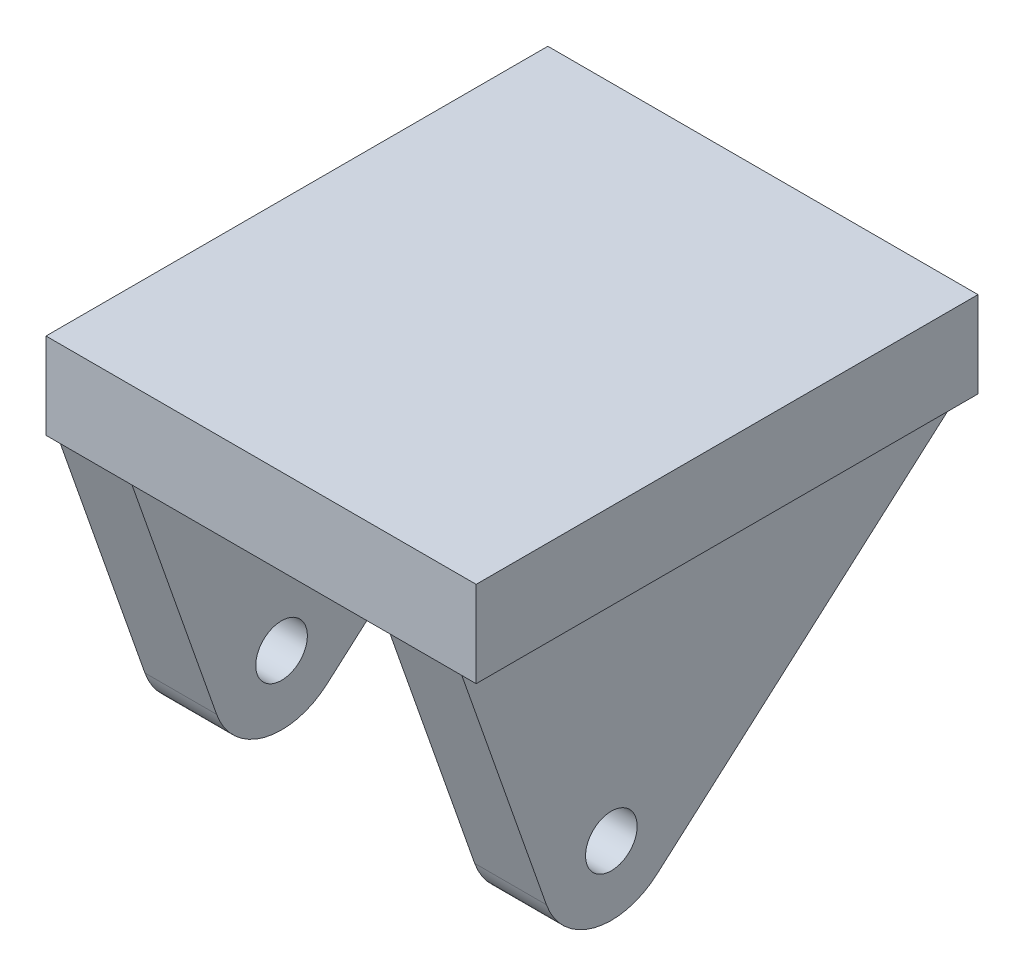
ISO-10303-21;
HEADER;
FILE_DESCRIPTION(('STEP AP214'),'2;1');
FILE_NAME('part.step','',(''),(''),'','','');
FILE_SCHEMA(('AUTOMOTIVE_DESIGN { 1 0 10303 214 1 1 1 1 }'));
ENDSEC;
DATA;
#1=APPLICATION_CONTEXT('core data for automotive mechanical design processes');
#2=APPLICATION_PROTOCOL_DEFINITION('international standard','automotive_design',2000,#1);
#3=PRODUCT_CONTEXT('',#1,'mechanical');
#4=PRODUCT('Part','Part','',(#3));
#5=PRODUCT_RELATED_PRODUCT_CATEGORY('part','',(#4));
#6=PRODUCT_DEFINITION_FORMATION('','',#4);
#7=PRODUCT_DEFINITION_CONTEXT('part definition',#1,'design');
#8=PRODUCT_DEFINITION('design','',#6,#7);
#9=PRODUCT_DEFINITION_SHAPE('','',#8);
#10=(LENGTH_UNIT() NAMED_UNIT(*) SI_UNIT(.MILLI.,.METRE.));
#11=(NAMED_UNIT(*) PLANE_ANGLE_UNIT() SI_UNIT($,.RADIAN.));
#12=(NAMED_UNIT(*) SI_UNIT($,.STERADIAN.) SOLID_ANGLE_UNIT());
#13=UNCERTAINTY_MEASURE_WITH_UNIT(LENGTH_MEASURE(1.E-05),#10,'distance_accuracy_value','');
#14=(GEOMETRIC_REPRESENTATION_CONTEXT(3) GLOBAL_UNCERTAINTY_ASSIGNED_CONTEXT((#13)) GLOBAL_UNIT_ASSIGNED_CONTEXT((#10,
#11,#12)) REPRESENTATION_CONTEXT('',''));
#15=CARTESIAN_POINT('',(0.,0.,0.));
#16=DIRECTION('',(0.,0.,1.));
#17=DIRECTION('',(1.,0.,0.));
#18=AXIS2_PLACEMENT_3D('',#15,#16,#17);
#19=CARTESIAN_POINT('',(-15.,-6.,17.5));
#20=DIRECTION('',(0.,1.,0.));
#21=DIRECTION('',(0.,0.,1.));
#22=AXIS2_PLACEMENT_3D('',#19,#20,#21);
#23=PLANE('',#22);
#24=DIRECTION('',(0.,0.,1.));
#25=VECTOR('',#24,1.);
#26=CARTESIAN_POINT('',(-14.,-6.,17.5));
#27=LINE('',#26,#25);
#28=CARTESIAN_POINT('',(-14.,-6.,-17.5));
#29=VERTEX_POINT('',#28);
#30=CARTESIAN_POINT('',(-14.,-6.,17.5));
#31=VERTEX_POINT('',#30);
#32=EDGE_CURVE('E57',#29,#31,#27,.T.);
#33=ORIENTED_EDGE('',*,*,#32,.T.);
#34=DIRECTION('',(1.,0.,0.));
#35=VECTOR('',#34,1.);
#36=CARTESIAN_POINT('',(-15.,-6.,17.5));
#37=LINE('',#36,#35);
#38=CARTESIAN_POINT('',(-15.,-6.,17.5));
#39=VERTEX_POINT('',#38);
#40=EDGE_CURVE('E234',#39,#31,#37,.T.);
#41=ORIENTED_EDGE('',*,*,#40,.F.);
#42=DIRECTION('',(0.,0.,-1.));
#43=VECTOR('',#42,1.);
#44=CARTESIAN_POINT('',(-15.,-6.,17.5));
#45=LINE('',#44,#43);
#46=CARTESIAN_POINT('',(-15.,-6.,-17.5));
#47=VERTEX_POINT('',#46);
#48=EDGE_CURVE('E11',#39,#47,#45,.T.);
#49=ORIENTED_EDGE('',*,*,#48,.T.);
#50=DIRECTION('',(1.,0.,0.));
#51=VECTOR('',#50,1.);
#52=CARTESIAN_POINT('',(-15.,-6.,-17.5));
#53=LINE('',#52,#51);
#54=EDGE_CURVE('E240',#47,#29,#53,.T.);
#55=ORIENTED_EDGE('',*,*,#54,.T.);
#56=EDGE_LOOP('',(#33,#41,#49,#55));
#57=FACE_BOUND('',#56,.T.);
#58=ADVANCED_FACE('F32',(#57),#23,.F.);
#59=DIRECTION('',(0.,0.,1.));
#60=VECTOR('',#59,1.);
#61=CARTESIAN_POINT('',(14.,-6.,17.5));
#62=LINE('',#61,#60);
#63=CARTESIAN_POINT('',(14.,-6.,-17.5));
#64=VERTEX_POINT('',#63);
#65=CARTESIAN_POINT('',(14.,-6.,17.5));
#66=VERTEX_POINT('',#65);
#67=EDGE_CURVE('E195',#64,#66,#62,.T.);
#68=ORIENTED_EDGE('',*,*,#67,.F.);
#69=CARTESIAN_POINT('',(15.,-6.,-17.5));
#70=VERTEX_POINT('',#69);
#71=EDGE_CURVE('E236',#64,#70,#53,.T.);
#72=ORIENTED_EDGE('',*,*,#71,.T.);
#73=DIRECTION('',(0.,0.,-1.));
#74=VECTOR('',#73,1.);
#75=CARTESIAN_POINT('',(15.,-6.,17.5));
#76=LINE('',#75,#74);
#77=CARTESIAN_POINT('',(15.,-6.,17.5));
#78=VERTEX_POINT('',#77);
#79=EDGE_CURVE('E42',#78,#70,#76,.T.);
#80=ORIENTED_EDGE('',*,*,#79,.F.);
#81=EDGE_CURVE('E191',#66,#78,#37,.T.);
#82=ORIENTED_EDGE('',*,*,#81,.F.);
#83=EDGE_LOOP('',(#68,#72,#80,#82));
#84=FACE_BOUND('',#83,.T.);
#85=ADVANCED_FACE('F295',(#84),#23,.F.);
#86=CARTESIAN_POINT('',(-15.,0.,17.5));
#87=DIRECTION('',(1.,0.,0.));
#88=DIRECTION('',(0.,0.,-1.));
#89=AXIS2_PLACEMENT_3D('',#86,#87,#88);
#90=PLANE('',#89);
#91=DIRECTION('',(0.,-1.,0.));
#92=VECTOR('',#91,1.);
#93=CARTESIAN_POINT('',(-15.,0.,-17.5));
#94=LINE('',#93,#92);
#95=CARTESIAN_POINT('',(-15.,0.,-17.5));
#96=VERTEX_POINT('',#95);
#97=EDGE_CURVE('E201',#96,#47,#94,.T.);
#98=ORIENTED_EDGE('',*,*,#97,.T.);
#99=ORIENTED_EDGE('',*,*,#48,.F.);
#100=DIRECTION('',(0.,-1.,0.));
#101=VECTOR('',#100,1.);
#102=CARTESIAN_POINT('',(-15.,0.,17.5));
#103=LINE('',#102,#101);
#104=CARTESIAN_POINT('',(-15.,0.,17.5));
#105=VERTEX_POINT('',#104);
#106=EDGE_CURVE('E225',#105,#39,#103,.T.);
#107=ORIENTED_EDGE('',*,*,#106,.F.);
#108=DIRECTION('',(0.,0.,-1.));
#109=VECTOR('',#108,1.);
#110=CARTESIAN_POINT('',(-15.,0.,17.5));
#111=LINE('',#110,#109);
#112=EDGE_CURVE('E259',#105,#96,#111,.T.);
#113=ORIENTED_EDGE('',*,*,#112,.T.);
#114=EDGE_LOOP('',(#98,#99,#107,#113));
#115=FACE_BOUND('',#114,.T.);
#116=ADVANCED_FACE('F34',(#115),#90,.F.);
#117=CARTESIAN_POINT('',(-9.,-6.,17.5));
#118=VERTEX_POINT('',#117);
#119=CARTESIAN_POINT('',(9.,-6.,17.5));
#120=VERTEX_POINT('',#119);
#121=EDGE_CURVE('E36',#118,#120,#37,.T.);
#122=ORIENTED_EDGE('',*,*,#121,.F.);
#123=DIRECTION('',(0.,0.,1.));
#124=VECTOR('',#123,1.);
#125=CARTESIAN_POINT('',(-9.,-6.,17.5));
#126=LINE('',#125,#124);
#127=CARTESIAN_POINT('',(-9.,-6.,-17.5));
#128=VERTEX_POINT('',#127);
#129=EDGE_CURVE('E148',#128,#118,#126,.T.);
#130=ORIENTED_EDGE('',*,*,#129,.F.);
#131=CARTESIAN_POINT('',(9.,-6.,-17.5));
#132=VERTEX_POINT('',#131);
#133=EDGE_CURVE('E239',#128,#132,#53,.T.);
#134=ORIENTED_EDGE('',*,*,#133,.T.);
#135=DIRECTION('',(0.,0.,1.));
#136=VECTOR('',#135,1.);
#137=CARTESIAN_POINT('',(9.,-6.,17.5));
#138=LINE('',#137,#136);
#139=EDGE_CURVE('E187',#132,#120,#138,.T.);
#140=ORIENTED_EDGE('',*,*,#139,.T.);
#141=EDGE_LOOP('',(#122,#130,#134,#140));
#142=FACE_BOUND('',#141,.T.);
#143=ADVANCED_FACE('F293',(#142),#23,.F.);
#144=CARTESIAN_POINT('',(15.,0.,17.5));
#145=DIRECTION('',(-1.,0.,0.));
#146=DIRECTION('',(0.,0.,1.));
#147=AXIS2_PLACEMENT_3D('',#144,#145,#146);
#148=PLANE('',#147);
#149=DIRECTION('',(0.,1.,0.));
#150=VECTOR('',#149,1.);
#151=CARTESIAN_POINT('',(15.,0.,-17.5));
#152=LINE('',#151,#150);
#153=CARTESIAN_POINT('',(15.,0.,-17.5));
#154=VERTEX_POINT('',#153);
#155=EDGE_CURVE('E244',#70,#154,#152,.T.);
#156=ORIENTED_EDGE('',*,*,#155,.T.);
#157=DIRECTION('',(0.,0.,-1.));
#158=VECTOR('',#157,1.);
#159=CARTESIAN_POINT('',(15.,0.,17.5));
#160=LINE('',#159,#158);
#161=CARTESIAN_POINT('',(15.,0.,17.5));
#162=VERTEX_POINT('',#161);
#163=EDGE_CURVE('E261',#162,#154,#160,.T.);
#164=ORIENTED_EDGE('',*,*,#163,.F.);
#165=DIRECTION('',(0.,1.,0.));
#166=VECTOR('',#165,1.);
#167=CARTESIAN_POINT('',(15.,0.,17.5));
#168=LINE('',#167,#166);
#169=EDGE_CURVE('E230',#78,#162,#168,.T.);
#170=ORIENTED_EDGE('',*,*,#169,.F.);
#171=ORIENTED_EDGE('',*,*,#79,.T.);
#172=EDGE_LOOP('',(#156,#164,#170,#171));
#173=FACE_BOUND('',#172,.T.);
#174=ADVANCED_FACE('F266',(#173),#148,.F.);
#175=CARTESIAN_POINT('',(-15.,0.,17.5));
#176=DIRECTION('',(0.,-1.,0.));
#177=DIRECTION('',(1.,0.,0.));
#178=AXIS2_PLACEMENT_3D('',#175,#176,#177);
#179=PLANE('',#178);
#180=DIRECTION('',(-1.,0.,0.));
#181=VECTOR('',#180,1.);
#182=CARTESIAN_POINT('',(-15.,0.,-17.5));
#183=LINE('',#182,#181);
#184=EDGE_CURVE('E227',#154,#96,#183,.T.);
#185=ORIENTED_EDGE('',*,*,#184,.T.);
#186=ORIENTED_EDGE('',*,*,#112,.F.);
#187=DIRECTION('',(-1.,0.,0.));
#188=VECTOR('',#187,1.);
#189=CARTESIAN_POINT('',(-15.,0.,17.5));
#190=LINE('',#189,#188);
#191=EDGE_CURVE('E262',#162,#105,#190,.T.);
#192=ORIENTED_EDGE('',*,*,#191,.F.);
#193=ORIENTED_EDGE('',*,*,#163,.T.);
#194=EDGE_LOOP('',(#185,#186,#192,#193));
#195=FACE_BOUND('',#194,.T.);
#196=ADVANCED_FACE('F279',(#195),#179,.F.);
#197=CARTESIAN_POINT('',(-15.,-6.,17.5));
#198=DIRECTION('',(0.,0.,1.));
#199=DIRECTION('',(1.,0.,0.));
#200=AXIS2_PLACEMENT_3D('',#197,#198,#199);
#201=PLANE('',#200);
#202=ORIENTED_EDGE('',*,*,#106,.T.);
#203=ORIENTED_EDGE('',*,*,#40,.T.);
#204=DIRECTION('',(1.,0.,0.));
#205=VECTOR('',#204,1.);
#206=CARTESIAN_POINT('',(-14.,-6.,17.5));
#207=LINE('',#206,#205);
#208=EDGE_CURVE('E147',#31,#118,#207,.T.);
#209=ORIENTED_EDGE('',*,*,#208,.T.);
#210=ORIENTED_EDGE('',*,*,#121,.T.);
#211=DIRECTION('',(1.,0.,0.));
#212=VECTOR('',#211,1.);
#213=CARTESIAN_POINT('',(9.,-6.,17.5));
#214=LINE('',#213,#212);
#215=EDGE_CURVE('E198',#120,#66,#214,.T.);
#216=ORIENTED_EDGE('',*,*,#215,.T.);
#217=ORIENTED_EDGE('',*,*,#81,.T.);
#218=ORIENTED_EDGE('',*,*,#169,.T.);
#219=ORIENTED_EDGE('',*,*,#191,.T.);
#220=EDGE_LOOP('',(#202,#203,#209,#210,#216,#217,#218,#219));
#221=FACE_BOUND('',#220,.T.);
#222=ADVANCED_FACE('F281',(#221),#201,.T.);
#223=CARTESIAN_POINT('',(-15.,-6.,-17.5));
#224=DIRECTION('',(0.,0.,1.));
#225=DIRECTION('',(1.,0.,0.));
#226=AXIS2_PLACEMENT_3D('',#223,#224,#225);
#227=PLANE('',#226);
#228=ORIENTED_EDGE('',*,*,#97,.F.);
#229=ORIENTED_EDGE('',*,*,#184,.F.);
#230=ORIENTED_EDGE('',*,*,#155,.F.);
#231=ORIENTED_EDGE('',*,*,#71,.F.);
#232=DIRECTION('',(1.,0.,0.));
#233=VECTOR('',#232,1.);
#234=CARTESIAN_POINT('',(9.,-6.,-17.5));
#235=LINE('',#234,#233);
#236=EDGE_CURVE('E202',#132,#64,#235,.T.);
#237=ORIENTED_EDGE('',*,*,#236,.F.);
#238=ORIENTED_EDGE('',*,*,#133,.F.);
#239=DIRECTION('',(1.,0.,0.));
#240=VECTOR('',#239,1.);
#241=CARTESIAN_POINT('',(-14.,-6.,-17.5));
#242=LINE('',#241,#240);
#243=EDGE_CURVE('E167',#29,#128,#242,.T.);
#244=ORIENTED_EDGE('',*,*,#243,.F.);
#245=ORIENTED_EDGE('',*,*,#54,.F.);
#246=EDGE_LOOP('',(#228,#229,#230,#231,#237,#238,#244,#245));
#247=FACE_BOUND('',#246,.T.);
#248=ADVANCED_FACE('F272',(#247),#227,.F.);
#249=CARTESIAN_POINT('',(9.,-6.,17.5));
#250=DIRECTION('',(0.,-0.331290931532783,0.943528652815664));
#251=DIRECTION('',(0.,-0.943528652815664,-0.331290931532783));
#252=AXIS2_PLACEMENT_3D('',#249,#250,#251);
#253=PLANE('',#252);
#254=DIRECTION('',(0.,-0.943528652815664,-0.331290931532783));
#255=VECTOR('',#254,1.);
#256=CARTESIAN_POINT('',(14.,-6.,17.5));
#257=LINE('',#256,#255);
#258=CARTESIAN_POINT('',(14.,-22.8033999069537,11.6000053453807));
#259=VERTEX_POINT('',#258);
#260=EDGE_CURVE('E174',#66,#259,#257,.T.);
#261=ORIENTED_EDGE('',*,*,#260,.F.);
#262=ORIENTED_EDGE('',*,*,#215,.F.);
#263=DIRECTION('',(0.,-0.943528652815664,-0.331290931532783));
#264=VECTOR('',#263,1.);
#265=CARTESIAN_POINT('',(9.,-6.,17.5));
#266=LINE('',#265,#264);
#267=CARTESIAN_POINT('',(9.,-22.8033999069537,11.6000053453807));
#268=VERTEX_POINT('',#267);
#269=EDGE_CURVE('E181',#120,#268,#266,.T.);
#270=ORIENTED_EDGE('',*,*,#269,.T.);
#271=DIRECTION('',(1.,0.,0.));
#272=VECTOR('',#271,1.);
#273=CARTESIAN_POINT('',(9.,-22.8033999069537,11.6000053453807));
#274=LINE('',#273,#272);
#275=EDGE_CURVE('E190',#268,#259,#274,.T.);
#276=ORIENTED_EDGE('',*,*,#275,.T.);
#277=EDGE_LOOP('',(#261,#262,#270,#276));
#278=FACE_BOUND('',#277,.T.);
#279=ADVANCED_FACE('F291',(#278),#253,.T.);
#280=CARTESIAN_POINT('',(9.,-6.,-17.5));
#281=DIRECTION('',(0.,-0.750981798252426,-0.660322904868181));
#282=DIRECTION('',(0.,0.660322904868181,-0.750981798252426));
#283=AXIS2_PLACEMENT_3D('',#280,#281,#282);
#284=PLANE('',#283);
#285=DIRECTION('',(0.,0.660322904868181,-0.750981798252426));
#286=VECTOR('',#285,1.);
#287=CARTESIAN_POINT('',(14.,-6.,-17.5));
#288=LINE('',#287,#286);
#289=CARTESIAN_POINT('',(14.,-24.817916067208,3.90151786849828));
#290=VERTEX_POINT('',#289);
#291=EDGE_CURVE('E213',#290,#64,#288,.T.);
#292=ORIENTED_EDGE('',*,*,#291,.F.);
#293=DIRECTION('',(1.,0.,0.));
#294=VECTOR('',#293,1.);
#295=CARTESIAN_POINT('',(9.,-24.817916067208,3.90151786849828));
#296=LINE('',#295,#294);
#297=CARTESIAN_POINT('',(9.,-24.817916067208,3.90151786849828));
#298=VERTEX_POINT('',#297);
#299=EDGE_CURVE('E206',#298,#290,#296,.T.);
#300=ORIENTED_EDGE('',*,*,#299,.F.);
#301=DIRECTION('',(0.,0.660322904868181,-0.750981798252426));
#302=VECTOR('',#301,1.);
#303=CARTESIAN_POINT('',(9.,-6.,-17.5));
#304=LINE('',#303,#302);
#305=EDGE_CURVE('E180',#298,#132,#304,.T.);
#306=ORIENTED_EDGE('',*,*,#305,.T.);
#307=ORIENTED_EDGE('',*,*,#236,.T.);
#308=EDGE_LOOP('',(#292,#300,#306,#307));
#309=FACE_BOUND('',#308,.T.);
#310=ADVANCED_FACE('F311',(#309),#284,.T.);
#311=CARTESIAN_POINT('',(9.,-21.2132034355964,7.07106781186553));
#312=DIRECTION('',(1.,0.,0.));
#313=DIRECTION('',(0.,0.,-1.));
#314=AXIS2_PLACEMENT_3D('',#311,#312,#313);
#315=CYLINDRICAL_SURFACE('',#314,4.79999999999997);
#316=CARTESIAN_POINT('',(14.,-21.2132034355964,7.07106781186553));
#317=DIRECTION('',(1.,0.,0.));
#318=DIRECTION('',(0.,0.,-1.));
#319=AXIS2_PLACEMENT_3D('',#316,#317,#318);
#320=CIRCLE('',#319,4.79999999999997);
#321=EDGE_CURVE('E184',#259,#290,#320,.T.);
#322=ORIENTED_EDGE('',*,*,#321,.F.);
#323=ORIENTED_EDGE('',*,*,#275,.F.);
#324=CARTESIAN_POINT('',(9.,-21.2132034355964,7.07106781186553));
#325=DIRECTION('',(1.,0.,0.));
#326=DIRECTION('',(0.,0.,-1.));
#327=AXIS2_PLACEMENT_3D('',#324,#325,#326);
#328=CIRCLE('',#327,4.79999999999997);
#329=EDGE_CURVE('E177',#268,#298,#328,.T.);
#330=ORIENTED_EDGE('',*,*,#329,.T.);
#331=ORIENTED_EDGE('',*,*,#299,.T.);
#332=EDGE_LOOP('',(#322,#323,#330,#331));
#333=FACE_BOUND('',#332,.T.);
#334=ADVANCED_FACE('F343',(#333),#315,.T.);
#335=CARTESIAN_POINT('',(9.,-21.2132034355964,7.07106781186553));
#336=DIRECTION('',(1.,0.,0.));
#337=DIRECTION('',(0.,0.,-1.));
#338=AXIS2_PLACEMENT_3D('',#335,#336,#337);
#339=PLANE('',#338);
#340=CARTESIAN_POINT('',(9.,-21.2132034355964,7.07106781186551));
#341=DIRECTION('',(1.,0.,0.));
#342=DIRECTION('',(0.,0.,-1.));
#343=AXIS2_PLACEMENT_3D('',#340,#341,#342);
#344=CIRCLE('',#343,1.79999999999995);
#345=CARTESIAN_POINT('',(9.,-21.2132034355964,5.27106781186555));
#346=VERTEX_POINT('',#345);
#347=EDGE_CURVE('E171',#346,#346,#344,.T.);
#348=ORIENTED_EDGE('',*,*,#347,.T.);
#349=EDGE_LOOP('',(#348));
#350=FACE_BOUND('',#349,.T.);
#351=ORIENTED_EDGE('',*,*,#269,.F.);
#352=ORIENTED_EDGE('',*,*,#139,.F.);
#353=ORIENTED_EDGE('',*,*,#305,.F.);
#354=ORIENTED_EDGE('',*,*,#329,.F.);
#355=EDGE_LOOP('',(#351,#352,#353,#354));
#356=FACE_BOUND('',#355,.T.);
#357=ADVANCED_FACE('F288',(#350,#356),#339,.F.);
#358=CARTESIAN_POINT('',(14.,-21.2132034355964,7.07106781186553));
#359=DIRECTION('',(1.,0.,0.));
#360=DIRECTION('',(0.,0.,-1.));
#361=AXIS2_PLACEMENT_3D('',#358,#359,#360);
#362=PLANE('',#361);
#363=CARTESIAN_POINT('',(14.,-21.2132034355964,7.07106781186551));
#364=DIRECTION('',(1.,0.,0.));
#365=DIRECTION('',(0.,0.,-1.));
#366=AXIS2_PLACEMENT_3D('',#363,#364,#365);
#367=CIRCLE('',#366,1.79999999999995);
#368=CARTESIAN_POINT('',(14.,-21.2132034355964,5.27106781186555));
#369=VERTEX_POINT('',#368);
#370=EDGE_CURVE('E166',#369,#369,#367,.T.);
#371=ORIENTED_EDGE('',*,*,#370,.F.);
#372=EDGE_LOOP('',(#371));
#373=FACE_BOUND('',#372,.T.);
#374=ORIENTED_EDGE('',*,*,#260,.T.);
#375=ORIENTED_EDGE('',*,*,#321,.T.);
#376=ORIENTED_EDGE('',*,*,#291,.T.);
#377=ORIENTED_EDGE('',*,*,#67,.T.);
#378=EDGE_LOOP('',(#374,#375,#376,#377));
#379=FACE_BOUND('',#378,.T.);
#380=ADVANCED_FACE('F306',(#373,#379),#362,.T.);
#381=CARTESIAN_POINT('',(9.,-21.2132034355964,7.07106781186551));
#382=DIRECTION('',(1.,0.,0.));
#383=DIRECTION('',(0.,0.,-1.));
#384=AXIS2_PLACEMENT_3D('',#381,#382,#383);
#385=CYLINDRICAL_SURFACE('',#384,1.79999999999995);
#386=ORIENTED_EDGE('',*,*,#347,.F.);
#387=EDGE_LOOP('',(#386));
#388=FACE_BOUND('',#387,.T.);
#389=ORIENTED_EDGE('',*,*,#370,.T.);
#390=EDGE_LOOP('',(#389));
#391=FACE_BOUND('',#390,.T.);
#392=ADVANCED_FACE('F337',(#388,#391),#385,.F.);
#393=CARTESIAN_POINT('',(-14.,-6.,17.5));
#394=DIRECTION('',(0.,-0.331290931532783,0.943528652815664));
#395=DIRECTION('',(0.,-0.943528652815664,-0.331290931532783));
#396=AXIS2_PLACEMENT_3D('',#393,#394,#395);
#397=PLANE('',#396);
#398=DIRECTION('',(0.,-0.943528652815664,-0.331290931532783));
#399=VECTOR('',#398,1.);
#400=CARTESIAN_POINT('',(-9.,-6.,17.5));
#401=LINE('',#400,#399);
#402=CARTESIAN_POINT('',(-9.,-22.8033999069537,11.6000053453807));
#403=VERTEX_POINT('',#402);
#404=EDGE_CURVE('E159',#118,#403,#401,.T.);
#405=ORIENTED_EDGE('',*,*,#404,.F.);
#406=ORIENTED_EDGE('',*,*,#208,.F.);
#407=DIRECTION('',(0.,-0.943528652815664,-0.331290931532783));
#408=VECTOR('',#407,1.);
#409=CARTESIAN_POINT('',(-14.,-6.,17.5));
#410=LINE('',#409,#408);
#411=CARTESIAN_POINT('',(-14.,-22.8033999069537,11.6000053453807));
#412=VERTEX_POINT('',#411);
#413=EDGE_CURVE('E141',#31,#412,#410,.T.);
#414=ORIENTED_EDGE('',*,*,#413,.T.);
#415=DIRECTION('',(1.,0.,0.));
#416=VECTOR('',#415,1.);
#417=CARTESIAN_POINT('',(-14.,-22.8033999069537,11.6000053453807));
#418=LINE('',#417,#416);
#419=EDGE_CURVE('E125',#412,#403,#418,.T.);
#420=ORIENTED_EDGE('',*,*,#419,.T.);
#421=EDGE_LOOP('',(#405,#406,#414,#420));
#422=FACE_BOUND('',#421,.T.);
#423=ADVANCED_FACE('F146',(#422),#397,.T.);
#424=CARTESIAN_POINT('',(-14.,-6.,-17.5));
#425=DIRECTION('',(0.,-0.750981798252426,-0.660322904868181));
#426=DIRECTION('',(0.,0.660322904868181,-0.750981798252426));
#427=AXIS2_PLACEMENT_3D('',#424,#425,#426);
#428=PLANE('',#427);
#429=DIRECTION('',(0.,0.660322904868181,-0.750981798252426));
#430=VECTOR('',#429,1.);
#431=CARTESIAN_POINT('',(-9.,-6.,-17.5));
#432=LINE('',#431,#430);
#433=CARTESIAN_POINT('',(-9.,-24.817916067208,3.90151786849828));
#434=VERTEX_POINT('',#433);
#435=EDGE_CURVE('E151',#434,#128,#432,.T.);
#436=ORIENTED_EDGE('',*,*,#435,.F.);
#437=DIRECTION('',(1.,0.,0.));
#438=VECTOR('',#437,1.);
#439=CARTESIAN_POINT('',(-14.,-24.817916067208,3.90151786849828));
#440=LINE('',#439,#438);
#441=CARTESIAN_POINT('',(-14.,-24.817916067208,3.90151786849828));
#442=VERTEX_POINT('',#441);
#443=EDGE_CURVE('E135',#442,#434,#440,.T.);
#444=ORIENTED_EDGE('',*,*,#443,.F.);
#445=DIRECTION('',(0.,0.660322904868181,-0.750981798252426));
#446=VECTOR('',#445,1.);
#447=CARTESIAN_POINT('',(-14.,-6.,-17.5));
#448=LINE('',#447,#446);
#449=EDGE_CURVE('E143',#442,#29,#448,.T.);
#450=ORIENTED_EDGE('',*,*,#449,.T.);
#451=ORIENTED_EDGE('',*,*,#243,.T.);
#452=EDGE_LOOP('',(#436,#444,#450,#451));
#453=FACE_BOUND('',#452,.T.);
#454=ADVANCED_FACE('F315',(#453),#428,.T.);
#455=CARTESIAN_POINT('',(-14.,-21.2132034355964,7.07106781186553));
#456=DIRECTION('',(1.,0.,0.));
#457=DIRECTION('',(0.,0.,-1.));
#458=AXIS2_PLACEMENT_3D('',#455,#456,#457);
#459=CYLINDRICAL_SURFACE('',#458,4.79999999999997);
#460=CARTESIAN_POINT('',(-9.,-21.2132034355964,7.07106781186553));
#461=DIRECTION('',(1.,0.,0.));
#462=DIRECTION('',(0.,0.,-1.));
#463=AXIS2_PLACEMENT_3D('',#460,#461,#462);
#464=CIRCLE('',#463,4.79999999999997);
#465=EDGE_CURVE('E130',#403,#434,#464,.T.);
#466=ORIENTED_EDGE('',*,*,#465,.F.);
#467=ORIENTED_EDGE('',*,*,#419,.F.);
#468=CARTESIAN_POINT('',(-14.,-21.2132034355964,7.07106781186553));
#469=DIRECTION('',(1.,0.,0.));
#470=DIRECTION('',(0.,0.,-1.));
#471=AXIS2_PLACEMENT_3D('',#468,#469,#470);
#472=CIRCLE('',#471,4.79999999999997);
#473=EDGE_CURVE('E128',#412,#442,#472,.T.);
#474=ORIENTED_EDGE('',*,*,#473,.T.);
#475=ORIENTED_EDGE('',*,*,#443,.T.);
#476=EDGE_LOOP('',(#466,#467,#474,#475));
#477=FACE_BOUND('',#476,.T.);
#478=ADVANCED_FACE('F127',(#477),#459,.T.);
#479=CARTESIAN_POINT('',(-14.,-21.2132034355964,7.07106781186553));
#480=DIRECTION('',(1.,0.,0.));
#481=DIRECTION('',(0.,0.,-1.));
#482=AXIS2_PLACEMENT_3D('',#479,#480,#481);
#483=PLANE('',#482);
#484=CARTESIAN_POINT('',(-14.,-21.2132034355964,7.07106781186551));
#485=DIRECTION('',(1.,0.,0.));
#486=DIRECTION('',(0.,0.,-1.));
#487=AXIS2_PLACEMENT_3D('',#484,#485,#486);
#488=CIRCLE('',#487,1.79999999999995);
#489=CARTESIAN_POINT('',(-14.,-21.2132034355964,5.27106781186555));
#490=VERTEX_POINT('',#489);
#491=EDGE_CURVE('E161',#490,#490,#488,.T.);
#492=ORIENTED_EDGE('',*,*,#491,.T.);
#493=EDGE_LOOP('',(#492));
#494=FACE_BOUND('',#493,.T.);
#495=ORIENTED_EDGE('',*,*,#413,.F.);
#496=ORIENTED_EDGE('',*,*,#32,.F.);
#497=ORIENTED_EDGE('',*,*,#449,.F.);
#498=ORIENTED_EDGE('',*,*,#473,.F.);
#499=EDGE_LOOP('',(#495,#496,#497,#498));
#500=FACE_BOUND('',#499,.T.);
#501=ADVANCED_FACE('F140',(#494,#500),#483,.F.);
#502=CARTESIAN_POINT('',(-9.,-21.2132034355964,7.07106781186553));
#503=DIRECTION('',(1.,0.,0.));
#504=DIRECTION('',(0.,0.,-1.));
#505=AXIS2_PLACEMENT_3D('',#502,#503,#504);
#506=PLANE('',#505);
#507=CARTESIAN_POINT('',(-9.,-21.2132034355964,7.07106781186551));
#508=DIRECTION('',(1.,0.,0.));
#509=DIRECTION('',(0.,0.,-1.));
#510=AXIS2_PLACEMENT_3D('',#507,#508,#509);
#511=CIRCLE('',#510,1.79999999999995);
#512=CARTESIAN_POINT('',(-9.,-21.2132034355964,5.27106781186555));
#513=VERTEX_POINT('',#512);
#514=EDGE_CURVE('E154',#513,#513,#511,.T.);
#515=ORIENTED_EDGE('',*,*,#514,.F.);
#516=EDGE_LOOP('',(#515));
#517=FACE_BOUND('',#516,.T.);
#518=ORIENTED_EDGE('',*,*,#404,.T.);
#519=ORIENTED_EDGE('',*,*,#465,.T.);
#520=ORIENTED_EDGE('',*,*,#435,.T.);
#521=ORIENTED_EDGE('',*,*,#129,.T.);
#522=EDGE_LOOP('',(#518,#519,#520,#521));
#523=FACE_BOUND('',#522,.T.);
#524=ADVANCED_FACE('F316',(#517,#523),#506,.T.);
#525=CARTESIAN_POINT('',(-14.,-21.2132034355964,7.07106781186551));
#526=DIRECTION('',(1.,0.,0.));
#527=DIRECTION('',(0.,0.,-1.));
#528=AXIS2_PLACEMENT_3D('',#525,#526,#527);
#529=CYLINDRICAL_SURFACE('',#528,1.79999999999995);
#530=ORIENTED_EDGE('',*,*,#491,.F.);
#531=EDGE_LOOP('',(#530));
#532=FACE_BOUND('',#531,.T.);
#533=ORIENTED_EDGE('',*,*,#514,.T.);
#534=EDGE_LOOP('',(#533));
#535=FACE_BOUND('',#534,.T.);
#536=ADVANCED_FACE('F318',(#532,#535),#529,.F.);
#537=CLOSED_SHELL('',(#58,#85,#116,#143,#174,#196,#222,#248,#279,#310,#334,#357,#380,#392,#423,
#454,#478,#501,#524,#536));
#538=MANIFOLD_SOLID_BREP('B2',#537);
#539=ADVANCED_BREP_SHAPE_REPRESENTATION('',(#18,#538),#14);
#540=SHAPE_DEFINITION_REPRESENTATION(#9,#539);
ENDSEC;
END-ISO-10303-21;
